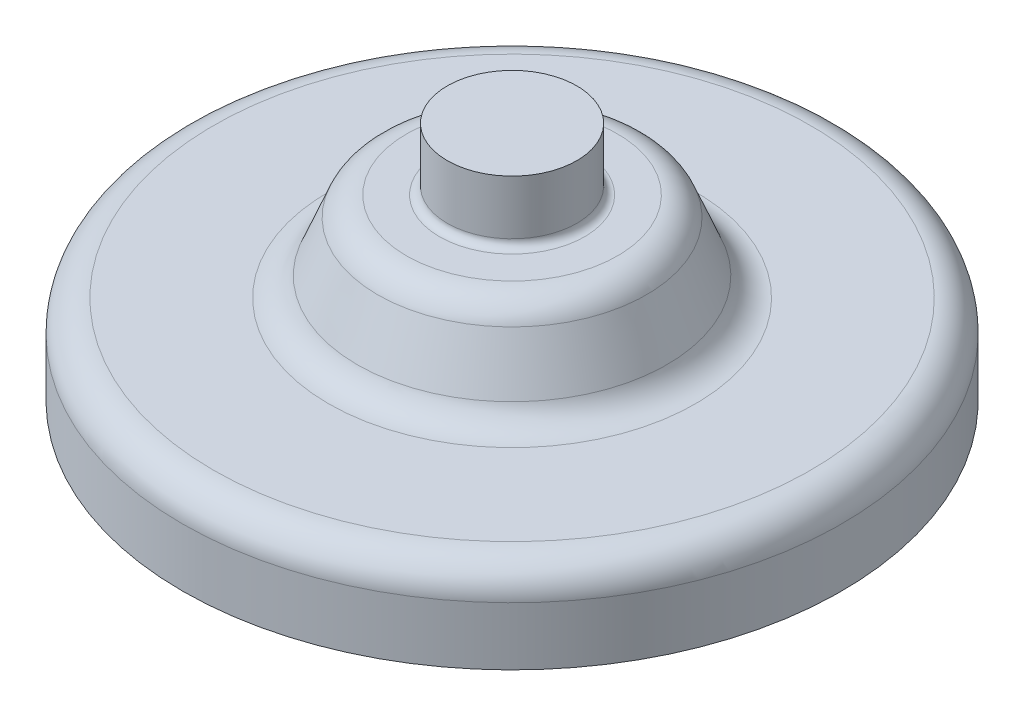
ISO-10303-21;
HEADER;
FILE_DESCRIPTION(('STEP AP214'),'2;1');
FILE_NAME('part.step','',(''),(''),'','','');
FILE_SCHEMA(('AUTOMOTIVE_DESIGN { 1 0 10303 214 1 1 1 1 }'));
ENDSEC;
DATA;
#1=APPLICATION_CONTEXT('core data for automotive mechanical design processes');
#2=APPLICATION_PROTOCOL_DEFINITION('international standard','automotive_design',2000,#1);
#3=PRODUCT_CONTEXT('',#1,'mechanical');
#4=PRODUCT('Part','Part','',(#3));
#5=PRODUCT_RELATED_PRODUCT_CATEGORY('part','',(#4));
#6=PRODUCT_DEFINITION_FORMATION('','',#4);
#7=PRODUCT_DEFINITION_CONTEXT('part definition',#1,'design');
#8=PRODUCT_DEFINITION('design','',#6,#7);
#9=PRODUCT_DEFINITION_SHAPE('','',#8);
#10=(LENGTH_UNIT() NAMED_UNIT(*) SI_UNIT(.MILLI.,.METRE.));
#11=(NAMED_UNIT(*) PLANE_ANGLE_UNIT() SI_UNIT($,.RADIAN.));
#12=(NAMED_UNIT(*) SI_UNIT($,.STERADIAN.) SOLID_ANGLE_UNIT());
#13=UNCERTAINTY_MEASURE_WITH_UNIT(LENGTH_MEASURE(1.E-05),#10,'distance_accuracy_value','');
#14=(GEOMETRIC_REPRESENTATION_CONTEXT(3) GLOBAL_UNCERTAINTY_ASSIGNED_CONTEXT((#13)) GLOBAL_UNIT_ASSIGNED_CONTEXT((#10,
#11,#12)) REPRESENTATION_CONTEXT('',''));
#15=CARTESIAN_POINT('',(0.,0.,0.));
#16=DIRECTION('',(0.,0.,1.));
#17=DIRECTION('',(1.,0.,0.));
#18=AXIS2_PLACEMENT_3D('',#15,#16,#17);
#19=CARTESIAN_POINT('',(48.1487266386805,24.,146.309506901231));
#20=DIRECTION('',(0.,1.,0.));
#21=DIRECTION('',(0.,0.,1.));
#22=AXIS2_PLACEMENT_3D('',#19,#20,#21);
#23=TOROIDAL_SURFACE('',#22,9.35500000000001,1.);
#24=CARTESIAN_POINT('',(48.1487266386805,24.,146.309506901231));
#25=DIRECTION('',(0.,1.,0.));
#26=DIRECTION('',(0.,0.,1.));
#27=AXIS2_PLACEMENT_3D('',#24,#25,#26);
#28=CIRCLE('',#27,8.355);
#29=CARTESIAN_POINT('',(48.1487266386805,24.,154.664506901231));
#30=VERTEX_POINT('',#29);
#31=EDGE_CURVE('E43',#30,#30,#28,.T.);
#32=ORIENTED_EDGE('',*,*,#31,.F.);
#33=EDGE_LOOP('',(#32));
#34=FACE_BOUND('',#33,.T.);
#35=CARTESIAN_POINT('',(48.1487266386805,23.,146.309506901231));
#36=DIRECTION('',(0.,1.,0.));
#37=DIRECTION('',(0.,0.,1.));
#38=AXIS2_PLACEMENT_3D('',#35,#36,#37);
#39=CIRCLE('',#38,9.35500000000001);
#40=CARTESIAN_POINT('',(48.1487266386805,23.,155.664506901231));
#41=VERTEX_POINT('',#40);
#42=EDGE_CURVE('E10',#41,#41,#39,.F.);
#43=ORIENTED_EDGE('',*,*,#42,.F.);
#44=EDGE_LOOP('',(#43));
#45=FACE_BOUND('',#44,.T.);
#46=ADVANCED_FACE('F37',(#34,#45),#23,.F.);
#47=CARTESIAN_POINT('',(48.1487266386805,11.5,146.309506901231));
#48=DIRECTION('',(0.,-1.,0.));
#49=DIRECTION('',(0.,0.,-1.));
#50=AXIS2_PLACEMENT_3D('',#47,#48,#49);
#51=CYLINDRICAL_SURFACE('',#50,42.5);
#52=CARTESIAN_POINT('',(48.1487266386805,7.5,146.309506901231));
#53=DIRECTION('',(0.,1.,0.));
#54=DIRECTION('',(0.,0.,1.));
#55=AXIS2_PLACEMENT_3D('',#52,#53,#54);
#56=CIRCLE('',#55,42.5);
#57=CARTESIAN_POINT('',(48.1487266386805,7.5,188.809506901231));
#58=VERTEX_POINT('',#57);
#59=EDGE_CURVE('E59',#58,#58,#56,.F.);
#60=ORIENTED_EDGE('',*,*,#59,.T.);
#61=EDGE_LOOP('',(#60));
#62=FACE_BOUND('',#61,.T.);
#63=CARTESIAN_POINT('',(48.1487266386805,0.,146.309506901231));
#64=DIRECTION('',(0.,1.,0.));
#65=DIRECTION('',(0.,0.,1.));
#66=AXIS2_PLACEMENT_3D('',#63,#64,#65);
#67=CIRCLE('',#66,42.5);
#68=CARTESIAN_POINT('',(48.1487266386805,0.,188.809506901231));
#69=VERTEX_POINT('',#68);
#70=EDGE_CURVE('E68',#69,#69,#67,.T.);
#71=ORIENTED_EDGE('',*,*,#70,.T.);
#72=EDGE_LOOP('',(#71));
#73=FACE_BOUND('',#72,.T.);
#74=ADVANCED_FACE('F91',(#62,#73),#51,.T.);
#75=CARTESIAN_POINT('',(48.1487266386805,11.5,146.309506901231));
#76=DIRECTION('',(0.,1.,0.));
#77=DIRECTION('',(0.,0.,1.));
#78=AXIS2_PLACEMENT_3D('',#75,#76,#77);
#79=PLANE('',#78);
#80=CARTESIAN_POINT('',(48.1487266386805,11.5,146.309506901231));
#81=DIRECTION('',(0.,1.,0.));
#82=DIRECTION('',(0.,0.,1.));
#83=AXIS2_PLACEMENT_3D('',#80,#81,#82);
#84=CIRCLE('',#83,38.5);
#85=CARTESIAN_POINT('',(48.1487266386805,11.5,184.809506901231));
#86=VERTEX_POINT('',#85);
#87=EDGE_CURVE('E62',#86,#86,#84,.T.);
#88=ORIENTED_EDGE('',*,*,#87,.T.);
#89=EDGE_LOOP('',(#88));
#90=FACE_BOUND('',#89,.T.);
#91=CARTESIAN_POINT('',(48.1487266386805,11.5,146.309506901231));
#92=DIRECTION('',(0.,1.,0.));
#93=DIRECTION('',(0.,0.,1.));
#94=AXIS2_PLACEMENT_3D('',#91,#92,#93);
#95=CIRCLE('',#94,23.6609256243484);
#96=CARTESIAN_POINT('',(48.1487266386805,11.5,169.970432525579));
#97=VERTEX_POINT('',#96);
#98=EDGE_CURVE('E65',#97,#97,#95,.F.);
#99=ORIENTED_EDGE('',*,*,#98,.T.);
#100=EDGE_LOOP('',(#99));
#101=FACE_BOUND('',#100,.T.);
#102=ADVANCED_FACE('F97',(#90,#101),#79,.T.);
#103=CARTESIAN_POINT('',(48.1487266386805,0.,146.309506901231));
#104=DIRECTION('',(0.,1.,0.));
#105=DIRECTION('',(0.,0.,1.));
#106=AXIS2_PLACEMENT_3D('',#103,#104,#105);
#107=PLANE('',#106);
#108=ORIENTED_EDGE('',*,*,#70,.F.);
#109=EDGE_LOOP('',(#108));
#110=FACE_BOUND('',#109,.T.);
#111=ADVANCED_FACE('F105',(#110),#107,.F.);
#112=CARTESIAN_POINT('',(48.1487266386805,11.5,146.309506901231));
#113=DIRECTION('',(0.,-1.,0.));
#114=DIRECTION('',(0.,0.,1.));
#115=AXIS2_PLACEMENT_3D('',#112,#113,#114);
#116=CONICAL_SURFACE('',#115,20.9628915569787,0.383972435438753);
#117=CARTESIAN_POINT('',(48.1487266386805,14.0015736263364,146.309506901231));
#118=DIRECTION('',(0.,1.,0.));
#119=DIRECTION('',(0.,0.,1.));
#120=AXIS2_PLACEMENT_3D('',#117,#118,#119);
#121=CIRCLE('',#120,19.9521902060813);
#122=CARTESIAN_POINT('',(48.1487266386805,14.0015736263364,166.261697107312));
#123=VERTEX_POINT('',#122);
#124=EDGE_CURVE('E51',#123,#123,#121,.T.);
#125=ORIENTED_EDGE('',*,*,#124,.T.);
#126=EDGE_LOOP('',(#125));
#127=FACE_BOUND('',#126,.T.);
#128=CARTESIAN_POINT('',(48.1487266386805,20.4984263736636,146.309506901231));
#129=DIRECTION('',(0.,-1.,0.));
#130=DIRECTION('',(0.,0.,-1.));
#131=AXIS2_PLACEMENT_3D('',#128,#129,#130);
#132=CIRCLE('',#131,17.3272913107719);
#133=CARTESIAN_POINT('',(48.1487266386805,20.4984263736636,128.982215590459));
#134=VERTEX_POINT('',#133);
#135=EDGE_CURVE('E56',#134,#134,#132,.T.);
#136=ORIENTED_EDGE('',*,*,#135,.T.);
#137=EDGE_LOOP('',(#136));
#138=FACE_BOUND('',#137,.T.);
#139=ADVANCED_FACE('F88',(#127,#138),#116,.T.);
#140=CARTESIAN_POINT('',(48.1487266386805,23.,146.309506901231));
#141=DIRECTION('',(0.,1.,0.));
#142=DIRECTION('',(0.,0.,1.));
#143=AXIS2_PLACEMENT_3D('',#140,#141,#142);
#144=PLANE('',#143);
#145=ORIENTED_EDGE('',*,*,#42,.T.);
#146=EDGE_LOOP('',(#145));
#147=FACE_BOUND('',#146,.T.);
#148=CARTESIAN_POINT('',(48.1487266386805,23.,146.309506901231));
#149=DIRECTION('',(0.,1.,0.));
#150=DIRECTION('',(0.,0.,1.));
#151=AXIS2_PLACEMENT_3D('',#148,#149,#150);
#152=CIRCLE('',#151,13.6185558925047);
#153=CARTESIAN_POINT('',(48.1487266386805,23.,159.928062793736));
#154=VERTEX_POINT('',#153);
#155=EDGE_CURVE('E47',#154,#154,#152,.T.);
#156=ORIENTED_EDGE('',*,*,#155,.T.);
#157=EDGE_LOOP('',(#156));
#158=FACE_BOUND('',#157,.T.);
#159=ADVANCED_FACE('F79',(#147,#158),#144,.T.);
#160=CARTESIAN_POINT('',(48.1487266386805,31.,146.309506901231));
#161=DIRECTION('',(0.,-1.,0.));
#162=DIRECTION('',(0.,0.,-1.));
#163=AXIS2_PLACEMENT_3D('',#160,#161,#162);
#164=CYLINDRICAL_SURFACE('',#163,8.355);
#165=ORIENTED_EDGE('',*,*,#31,.T.);
#166=EDGE_LOOP('',(#165));
#167=FACE_BOUND('',#166,.T.);
#168=CARTESIAN_POINT('',(48.1487266386805,31.,146.309506901231));
#169=DIRECTION('',(0.,1.,0.));
#170=DIRECTION('',(0.,0.,1.));
#171=AXIS2_PLACEMENT_3D('',#168,#169,#170);
#172=CIRCLE('',#171,8.355);
#173=CARTESIAN_POINT('',(48.1487266386805,31.,154.664506901231));
#174=VERTEX_POINT('',#173);
#175=EDGE_CURVE('E71',#174,#174,#172,.T.);
#176=ORIENTED_EDGE('',*,*,#175,.F.);
#177=EDGE_LOOP('',(#176));
#178=FACE_BOUND('',#177,.T.);
#179=ADVANCED_FACE('F77',(#167,#178),#164,.T.);
#180=CARTESIAN_POINT('',(48.1487266386805,31.,146.309506901231));
#181=DIRECTION('',(0.,1.,0.));
#182=DIRECTION('',(0.,0.,1.));
#183=AXIS2_PLACEMENT_3D('',#180,#181,#182);
#184=PLANE('',#183);
#185=ORIENTED_EDGE('',*,*,#175,.T.);
#186=EDGE_LOOP('',(#185));
#187=FACE_BOUND('',#186,.T.);
#188=ADVANCED_FACE('F75',(#187),#184,.T.);
#189=CARTESIAN_POINT('',(48.1487266386805,7.5,146.309506901231));
#190=DIRECTION('',(0.,1.,0.));
#191=DIRECTION('',(0.,0.,1.));
#192=AXIS2_PLACEMENT_3D('',#189,#190,#191);
#193=TOROIDAL_SURFACE('',#192,38.5,4.);
#194=ORIENTED_EDGE('',*,*,#59,.F.);
#195=EDGE_LOOP('',(#194));
#196=FACE_BOUND('',#195,.T.);
#197=ORIENTED_EDGE('',*,*,#87,.F.);
#198=EDGE_LOOP('',(#197));
#199=FACE_BOUND('',#198,.T.);
#200=ADVANCED_FACE('F86',(#196,#199),#193,.T.);
#201=CARTESIAN_POINT('',(48.1487266386805,15.5,146.309506901231));
#202=DIRECTION('',(0.,1.,0.));
#203=DIRECTION('',(0.,0.,1.));
#204=AXIS2_PLACEMENT_3D('',#201,#202,#203);
#205=TOROIDAL_SURFACE('',#204,23.6609256243484,4.);
#206=ORIENTED_EDGE('',*,*,#98,.F.);
#207=EDGE_LOOP('',(#206));
#208=FACE_BOUND('',#207,.T.);
#209=ORIENTED_EDGE('',*,*,#124,.F.);
#210=EDGE_LOOP('',(#209));
#211=FACE_BOUND('',#210,.T.);
#212=ADVANCED_FACE('F113',(#208,#211),#205,.F.);
#213=CARTESIAN_POINT('',(48.1487266386805,19.,146.309506901231));
#214=DIRECTION('',(0.,1.,0.));
#215=DIRECTION('',(0.,0.,1.));
#216=AXIS2_PLACEMENT_3D('',#213,#214,#215);
#217=TOROIDAL_SURFACE('',#216,13.6185558925047,4.);
#218=ORIENTED_EDGE('',*,*,#135,.F.);
#219=EDGE_LOOP('',(#218));
#220=FACE_BOUND('',#219,.T.);
#221=ORIENTED_EDGE('',*,*,#155,.F.);
#222=EDGE_LOOP('',(#221));
#223=FACE_BOUND('',#222,.T.);
#224=ADVANCED_FACE('F116',(#220,#223),#217,.T.);
#225=CLOSED_SHELL('',(#46,#74,#102,#111,#139,#159,#179,#188,#200,#212,#224));
#226=MANIFOLD_SOLID_BREP('B2',#225);
#227=ADVANCED_BREP_SHAPE_REPRESENTATION('',(#18,#226),#14);
#228=SHAPE_DEFINITION_REPRESENTATION(#9,#227);
ENDSEC;
END-ISO-10303-21;
